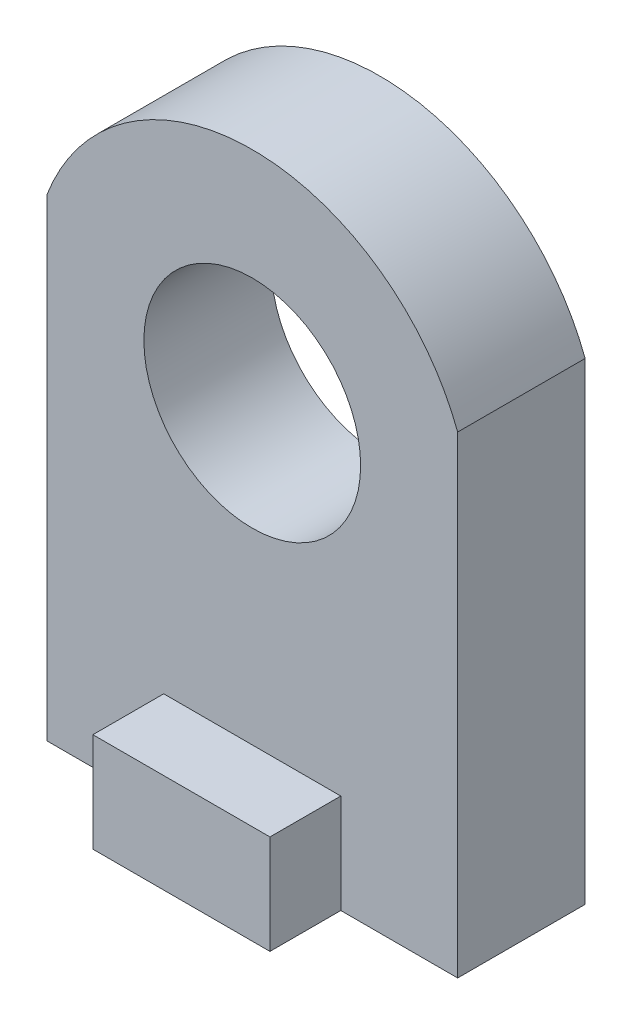
ISO-10303-21;
HEADER;
FILE_DESCRIPTION(('STEP AP214'),'2;1');
FILE_NAME('part.step','',(''),(''),'','','');
FILE_SCHEMA(('AUTOMOTIVE_DESIGN { 1 0 10303 214 1 1 1 1 }'));
ENDSEC;
DATA;
#1=APPLICATION_CONTEXT('core data for automotive mechanical design processes');
#2=APPLICATION_PROTOCOL_DEFINITION('international standard','automotive_design',2000,#1);
#3=PRODUCT_CONTEXT('',#1,'mechanical');
#4=PRODUCT('Part','Part','',(#3));
#5=PRODUCT_RELATED_PRODUCT_CATEGORY('part','',(#4));
#6=PRODUCT_DEFINITION_FORMATION('','',#4);
#7=PRODUCT_DEFINITION_CONTEXT('part definition',#1,'design');
#8=PRODUCT_DEFINITION('design','',#6,#7);
#9=PRODUCT_DEFINITION_SHAPE('','',#8);
#10=(LENGTH_UNIT() NAMED_UNIT(*) SI_UNIT(.MILLI.,.METRE.));
#11=(NAMED_UNIT(*) PLANE_ANGLE_UNIT() SI_UNIT($,.RADIAN.));
#12=(NAMED_UNIT(*) SI_UNIT($,.STERADIAN.) SOLID_ANGLE_UNIT());
#13=UNCERTAINTY_MEASURE_WITH_UNIT(LENGTH_MEASURE(1.E-05),#10,'distance_accuracy_value','');
#14=(GEOMETRIC_REPRESENTATION_CONTEXT(3) GLOBAL_UNCERTAINTY_ASSIGNED_CONTEXT((#13)) GLOBAL_UNIT_ASSIGNED_CONTEXT((#10,
#11,#12)) REPRESENTATION_CONTEXT('',''));
#15=CARTESIAN_POINT('',(0.,0.,0.));
#16=DIRECTION('',(0.,0.,1.));
#17=DIRECTION('',(1.,0.,0.));
#18=AXIS2_PLACEMENT_3D('',#15,#16,#17);
#19=CARTESIAN_POINT('',(0.,11.2113872124742,9.));
#20=DIRECTION('',(0.,0.,-1.));
#21=DIRECTION('',(-1.,0.,0.));
#22=AXIS2_PLACEMENT_3D('',#19,#20,#21);
#23=PLANE('',#22);
#24=CARTESIAN_POINT('',(0.,11.2113872124742,9.));
#25=DIRECTION('',(0.,0.,1.));
#26=DIRECTION('',(1.,0.,0.));
#27=AXIS2_PLACEMENT_3D('',#24,#25,#26);
#28=CIRCLE('',#27,7.65);
#29=CARTESIAN_POINT('',(7.65,11.2113872124742,9.));
#30=VERTEX_POINT('',#29);
#31=EDGE_CURVE('E126',#30,#30,#28,.T.);
#32=ORIENTED_EDGE('',*,*,#31,.F.);
#33=EDGE_LOOP('',(#32));
#34=FACE_BOUND('',#33,.T.);
#35=DIRECTION('',(0.,-1.,0.));
#36=VECTOR('',#35,1.);
#37=CARTESIAN_POINT('',(-6.25,-16.6886127875258,9.));
#38=LINE('',#37,#36);
#39=CARTESIAN_POINT('',(-6.25,-9.68861278752581,9.));
#40=VERTEX_POINT('',#39);
#41=CARTESIAN_POINT('',(-6.25,-16.6886127875258,9.));
#42=VERTEX_POINT('',#41);
#43=EDGE_CURVE('E51',#40,#42,#38,.T.);
#44=ORIENTED_EDGE('',*,*,#43,.F.);
#45=DIRECTION('',(-1.,0.,0.));
#46=VECTOR('',#45,1.);
#47=CARTESIAN_POINT('',(-6.25,-9.68861278752581,9.));
#48=LINE('',#47,#46);
#49=CARTESIAN_POINT('',(6.25,-9.68861278752581,9.));
#50=VERTEX_POINT('',#49);
#51=EDGE_CURVE('E120',#50,#40,#48,.T.);
#52=ORIENTED_EDGE('',*,*,#51,.F.);
#53=DIRECTION('',(0.,1.,0.));
#54=VECTOR('',#53,1.);
#55=CARTESIAN_POINT('',(6.25,-16.6886127875258,9.));
#56=LINE('',#55,#54);
#57=CARTESIAN_POINT('',(6.25,-16.6886127875258,9.));
#58=VERTEX_POINT('',#57);
#59=EDGE_CURVE('E57',#58,#50,#56,.T.);
#60=ORIENTED_EDGE('',*,*,#59,.F.);
#61=DIRECTION('',(1.,0.,0.));
#62=VECTOR('',#61,1.);
#63=CARTESIAN_POINT('',(-14.5,-16.6886127875258,9.));
#64=LINE('',#63,#62);
#65=CARTESIAN_POINT('',(14.5,-16.6886127875258,9.));
#66=VERTEX_POINT('',#65);
#67=EDGE_CURVE('E141',#58,#66,#64,.T.);
#68=ORIENTED_EDGE('',*,*,#67,.T.);
#69=DIRECTION('',(0.,1.,0.));
#70=VECTOR('',#69,1.);
#71=CARTESIAN_POINT('',(14.5,-16.6886127875258,9.));
#72=LINE('',#71,#70);
#73=CARTESIAN_POINT('',(14.5,16.6886127875258,9.));
#74=VERTEX_POINT('',#73);
#75=EDGE_CURVE('E144',#66,#74,#72,.T.);
#76=ORIENTED_EDGE('',*,*,#75,.T.);
#77=CARTESIAN_POINT('',(0.,11.2113872124742,9.));
#78=DIRECTION('',(0.,0.,1.));
#79=DIRECTION('',(-1.,0.,0.));
#80=AXIS2_PLACEMENT_3D('',#77,#78,#79);
#81=CIRCLE('',#80,15.5);
#82=CARTESIAN_POINT('',(-14.5,16.6886127875258,9.));
#83=VERTEX_POINT('',#82);
#84=EDGE_CURVE('E135',#74,#83,#81,.T.);
#85=ORIENTED_EDGE('',*,*,#84,.T.);
#86=DIRECTION('',(0.,-1.,0.));
#87=VECTOR('',#86,1.);
#88=CARTESIAN_POINT('',(-14.5,-16.6886127875258,9.));
#89=LINE('',#88,#87);
#90=CARTESIAN_POINT('',(-14.5,-16.6886127875258,9.));
#91=VERTEX_POINT('',#90);
#92=EDGE_CURVE('E138',#83,#91,#89,.T.);
#93=ORIENTED_EDGE('',*,*,#92,.T.);
#94=EDGE_CURVE('E142',#91,#42,#64,.T.);
#95=ORIENTED_EDGE('',*,*,#94,.T.);
#96=EDGE_LOOP('',(#44,#52,#60,#68,#76,#85,#93,#95));
#97=FACE_BOUND('',#96,.T.);
#98=ADVANCED_FACE('F36',(#34,#97),#23,.F.);
#99=CARTESIAN_POINT('',(0.,11.2113872124742,0.));
#100=DIRECTION('',(0.,0.,-1.));
#101=DIRECTION('',(-1.,0.,0.));
#102=AXIS2_PLACEMENT_3D('',#99,#100,#101);
#103=PLANE('',#102);
#104=CARTESIAN_POINT('',(0.,11.2113872124742,0.));
#105=DIRECTION('',(0.,0.,1.));
#106=DIRECTION('',(-1.,0.,0.));
#107=AXIS2_PLACEMENT_3D('',#104,#105,#106);
#108=CIRCLE('',#107,15.5);
#109=CARTESIAN_POINT('',(14.5,16.6886127875258,0.));
#110=VERTEX_POINT('',#109);
#111=CARTESIAN_POINT('',(-14.5,16.6886127875258,0.));
#112=VERTEX_POINT('',#111);
#113=EDGE_CURVE('E133',#110,#112,#108,.T.);
#114=ORIENTED_EDGE('',*,*,#113,.F.);
#115=DIRECTION('',(0.,1.,0.));
#116=VECTOR('',#115,1.);
#117=CARTESIAN_POINT('',(14.5,-16.6886127875258,0.));
#118=LINE('',#117,#116);
#119=CARTESIAN_POINT('',(14.5,-16.6886127875258,0.));
#120=VERTEX_POINT('',#119);
#121=EDGE_CURVE('E139',#120,#110,#118,.T.);
#122=ORIENTED_EDGE('',*,*,#121,.F.);
#123=DIRECTION('',(1.,0.,0.));
#124=VECTOR('',#123,1.);
#125=CARTESIAN_POINT('',(-14.5,-16.6886127875258,0.));
#126=LINE('',#125,#124);
#127=CARTESIAN_POINT('',(-14.5,-16.6886127875258,0.));
#128=VERTEX_POINT('',#127);
#129=EDGE_CURVE('E151',#128,#120,#126,.T.);
#130=ORIENTED_EDGE('',*,*,#129,.F.);
#131=DIRECTION('',(0.,-1.,0.));
#132=VECTOR('',#131,1.);
#133=CARTESIAN_POINT('',(-14.5,-16.6886127875258,0.));
#134=LINE('',#133,#132);
#135=EDGE_CURVE('E149',#112,#128,#134,.T.);
#136=ORIENTED_EDGE('',*,*,#135,.F.);
#137=EDGE_LOOP('',(#114,#122,#130,#136));
#138=FACE_BOUND('',#137,.T.);
#139=CARTESIAN_POINT('',(0.,11.2113872124742,0.));
#140=DIRECTION('',(0.,0.,1.));
#141=DIRECTION('',(1.,0.,0.));
#142=AXIS2_PLACEMENT_3D('',#139,#140,#141);
#143=CIRCLE('',#142,7.65);
#144=CARTESIAN_POINT('',(7.65,11.2113872124742,0.));
#145=VERTEX_POINT('',#144);
#146=EDGE_CURVE('E123',#145,#145,#143,.T.);
#147=ORIENTED_EDGE('',*,*,#146,.T.);
#148=EDGE_LOOP('',(#147));
#149=FACE_BOUND('',#148,.T.);
#150=ADVANCED_FACE('F166',(#138,#149),#103,.T.);
#151=CARTESIAN_POINT('',(0.,11.2113872124742,9.));
#152=DIRECTION('',(0.,0.,-1.));
#153=DIRECTION('',(-1.,0.,0.));
#154=AXIS2_PLACEMENT_3D('',#151,#152,#153);
#155=CYLINDRICAL_SURFACE('',#154,15.5);
#156=ORIENTED_EDGE('',*,*,#113,.T.);
#157=DIRECTION('',(0.,0.,-1.));
#158=VECTOR('',#157,1.);
#159=CARTESIAN_POINT('',(-14.5,16.6886127875258,9.));
#160=LINE('',#159,#158);
#161=EDGE_CURVE('E11',#83,#112,#160,.T.);
#162=ORIENTED_EDGE('',*,*,#161,.F.);
#163=ORIENTED_EDGE('',*,*,#84,.F.);
#164=DIRECTION('',(0.,0.,-1.));
#165=VECTOR('',#164,1.);
#166=CARTESIAN_POINT('',(14.5,16.6886127875258,9.));
#167=LINE('',#166,#165);
#168=EDGE_CURVE('E146',#74,#110,#167,.T.);
#169=ORIENTED_EDGE('',*,*,#168,.T.);
#170=EDGE_LOOP('',(#156,#162,#163,#169));
#171=FACE_BOUND('',#170,.T.);
#172=ADVANCED_FACE('F38',(#171),#155,.T.);
#173=CARTESIAN_POINT('',(-14.5,-16.6886127875258,9.));
#174=DIRECTION('',(1.,0.,0.));
#175=DIRECTION('',(0.,1.,0.));
#176=AXIS2_PLACEMENT_3D('',#173,#174,#175);
#177=PLANE('',#176);
#178=ORIENTED_EDGE('',*,*,#135,.T.);
#179=DIRECTION('',(0.,0.,-1.));
#180=VECTOR('',#179,1.);
#181=CARTESIAN_POINT('',(-14.5,-16.6886127875258,9.));
#182=LINE('',#181,#180);
#183=EDGE_CURVE('E44',#91,#128,#182,.T.);
#184=ORIENTED_EDGE('',*,*,#183,.F.);
#185=ORIENTED_EDGE('',*,*,#92,.F.);
#186=ORIENTED_EDGE('',*,*,#161,.T.);
#187=EDGE_LOOP('',(#178,#184,#185,#186));
#188=FACE_BOUND('',#187,.T.);
#189=ADVANCED_FACE('F211',(#188),#177,.F.);
#190=CARTESIAN_POINT('',(-14.5,-16.6886127875258,9.));
#191=DIRECTION('',(0.,1.,0.));
#192=DIRECTION('',(0.,0.,1.));
#193=AXIS2_PLACEMENT_3D('',#190,#191,#192);
#194=PLANE('',#193);
#195=ORIENTED_EDGE('',*,*,#129,.T.);
#196=DIRECTION('',(0.,0.,-1.));
#197=VECTOR('',#196,1.);
#198=CARTESIAN_POINT('',(14.5,-16.6886127875258,9.));
#199=LINE('',#198,#197);
#200=EDGE_CURVE('E156',#66,#120,#199,.T.);
#201=ORIENTED_EDGE('',*,*,#200,.F.);
#202=ORIENTED_EDGE('',*,*,#67,.F.);
#203=DIRECTION('',(0.,0.,-1.));
#204=VECTOR('',#203,1.);
#205=CARTESIAN_POINT('',(6.25,-16.6886127875258,14.));
#206=LINE('',#205,#204);
#207=CARTESIAN_POINT('',(6.25,-16.6886127875258,14.));
#208=VERTEX_POINT('',#207);
#209=EDGE_CURVE('E107',#208,#58,#206,.T.);
#210=ORIENTED_EDGE('',*,*,#209,.F.);
#211=DIRECTION('',(1.,0.,0.));
#212=VECTOR('',#211,1.);
#213=CARTESIAN_POINT('',(-6.25,-16.6886127875258,14.));
#214=LINE('',#213,#212);
#215=CARTESIAN_POINT('',(-6.25,-16.6886127875258,14.));
#216=VERTEX_POINT('',#215);
#217=EDGE_CURVE('E100',#216,#208,#214,.T.);
#218=ORIENTED_EDGE('',*,*,#217,.F.);
#219=DIRECTION('',(0.,0.,-1.));
#220=VECTOR('',#219,1.);
#221=CARTESIAN_POINT('',(-6.25,-16.6886127875258,14.));
#222=LINE('',#221,#220);
#223=EDGE_CURVE('E105',#216,#42,#222,.T.);
#224=ORIENTED_EDGE('',*,*,#223,.T.);
#225=ORIENTED_EDGE('',*,*,#94,.F.);
#226=ORIENTED_EDGE('',*,*,#183,.T.);
#227=EDGE_LOOP('',(#195,#201,#202,#210,#218,#224,#225,#226));
#228=FACE_BOUND('',#227,.T.);
#229=ADVANCED_FACE('F102',(#228),#194,.F.);
#230=CARTESIAN_POINT('',(14.5,-16.6886127875258,9.));
#231=DIRECTION('',(-1.,0.,0.));
#232=DIRECTION('',(0.,-1.,0.));
#233=AXIS2_PLACEMENT_3D('',#230,#231,#232);
#234=PLANE('',#233);
#235=ORIENTED_EDGE('',*,*,#121,.T.);
#236=ORIENTED_EDGE('',*,*,#168,.F.);
#237=ORIENTED_EDGE('',*,*,#75,.F.);
#238=ORIENTED_EDGE('',*,*,#200,.T.);
#239=EDGE_LOOP('',(#235,#236,#237,#238));
#240=FACE_BOUND('',#239,.T.);
#241=ADVANCED_FACE('F170',(#240),#234,.F.);
#242=CARTESIAN_POINT('',(0.,11.2113872124742,9.));
#243=DIRECTION('',(0.,0.,-1.));
#244=DIRECTION('',(-1.,0.,0.));
#245=AXIS2_PLACEMENT_3D('',#242,#243,#244);
#246=CYLINDRICAL_SURFACE('',#245,7.65);
#247=ORIENTED_EDGE('',*,*,#31,.T.);
#248=EDGE_LOOP('',(#247));
#249=FACE_BOUND('',#248,.T.);
#250=ORIENTED_EDGE('',*,*,#146,.F.);
#251=EDGE_LOOP('',(#250));
#252=FACE_BOUND('',#251,.T.);
#253=ADVANCED_FACE('F205',(#249,#252),#246,.F.);
#254=CARTESIAN_POINT('',(-6.25,-16.6886127875258,14.));
#255=DIRECTION('',(1.,0.,0.));
#256=DIRECTION('',(0.,0.,-1.));
#257=AXIS2_PLACEMENT_3D('',#254,#255,#256);
#258=PLANE('',#257);
#259=ORIENTED_EDGE('',*,*,#43,.T.);
#260=ORIENTED_EDGE('',*,*,#223,.F.);
#261=DIRECTION('',(0.,-1.,0.));
#262=VECTOR('',#261,1.);
#263=CARTESIAN_POINT('',(-6.25,-16.6886127875258,14.));
#264=LINE('',#263,#262);
#265=CARTESIAN_POINT('',(-6.25,-9.68861278752581,14.));
#266=VERTEX_POINT('',#265);
#267=EDGE_CURVE('E111',#266,#216,#264,.T.);
#268=ORIENTED_EDGE('',*,*,#267,.F.);
#269=DIRECTION('',(0.,0.,-1.));
#270=VECTOR('',#269,1.);
#271=CARTESIAN_POINT('',(-6.25,-9.68861278752581,14.));
#272=LINE('',#271,#270);
#273=EDGE_CURVE('E180',#266,#40,#272,.T.);
#274=ORIENTED_EDGE('',*,*,#273,.T.);
#275=EDGE_LOOP('',(#259,#260,#268,#274));
#276=FACE_BOUND('',#275,.T.);
#277=ADVANCED_FACE('F122',(#276),#258,.F.);
#278=CARTESIAN_POINT('',(6.25,-16.6886127875258,14.));
#279=DIRECTION('',(-1.,0.,0.));
#280=DIRECTION('',(0.,-1.,0.));
#281=AXIS2_PLACEMENT_3D('',#278,#279,#280);
#282=PLANE('',#281);
#283=ORIENTED_EDGE('',*,*,#59,.T.);
#284=DIRECTION('',(0.,0.,-1.));
#285=VECTOR('',#284,1.);
#286=CARTESIAN_POINT('',(6.25,-9.68861278752581,14.));
#287=LINE('',#286,#285);
#288=CARTESIAN_POINT('',(6.25,-9.68861278752581,14.));
#289=VERTEX_POINT('',#288);
#290=EDGE_CURVE('E128',#289,#50,#287,.T.);
#291=ORIENTED_EDGE('',*,*,#290,.F.);
#292=DIRECTION('',(0.,1.,0.));
#293=VECTOR('',#292,1.);
#294=CARTESIAN_POINT('',(6.25,-16.6886127875258,14.));
#295=LINE('',#294,#293);
#296=EDGE_CURVE('E110',#208,#289,#295,.T.);
#297=ORIENTED_EDGE('',*,*,#296,.F.);
#298=ORIENTED_EDGE('',*,*,#209,.T.);
#299=EDGE_LOOP('',(#283,#291,#297,#298));
#300=FACE_BOUND('',#299,.T.);
#301=ADVANCED_FACE('F176',(#300),#282,.F.);
#302=CARTESIAN_POINT('',(-6.25,-9.68861278752581,14.));
#303=DIRECTION('',(0.,-1.,0.));
#304=DIRECTION('',(1.,0.,0.));
#305=AXIS2_PLACEMENT_3D('',#302,#303,#304);
#306=PLANE('',#305);
#307=ORIENTED_EDGE('',*,*,#51,.T.);
#308=ORIENTED_EDGE('',*,*,#273,.F.);
#309=DIRECTION('',(-1.,0.,0.));
#310=VECTOR('',#309,1.);
#311=CARTESIAN_POINT('',(-6.25,-9.68861278752581,14.));
#312=LINE('',#311,#310);
#313=EDGE_CURVE('E116',#289,#266,#312,.T.);
#314=ORIENTED_EDGE('',*,*,#313,.F.);
#315=ORIENTED_EDGE('',*,*,#290,.T.);
#316=EDGE_LOOP('',(#307,#308,#314,#315));
#317=FACE_BOUND('',#316,.T.);
#318=ADVANCED_FACE('F187',(#317),#306,.F.);
#319=CARTESIAN_POINT('',(0.,0.,14.));
#320=DIRECTION('',(0.,0.,-1.));
#321=DIRECTION('',(-1.,0.,0.));
#322=AXIS2_PLACEMENT_3D('',#319,#320,#321);
#323=PLANE('',#322);
#324=ORIENTED_EDGE('',*,*,#267,.T.);
#325=ORIENTED_EDGE('',*,*,#217,.T.);
#326=ORIENTED_EDGE('',*,*,#296,.T.);
#327=ORIENTED_EDGE('',*,*,#313,.T.);
#328=EDGE_LOOP('',(#324,#325,#326,#327));
#329=FACE_BOUND('',#328,.T.);
#330=ADVANCED_FACE('F114',(#329),#323,.F.);
#331=CLOSED_SHELL('',(#98,#150,#172,#189,#229,#241,#253,#277,#301,#318,#330));
#332=MANIFOLD_SOLID_BREP('B2',#331);
#333=ADVANCED_BREP_SHAPE_REPRESENTATION('',(#18,#332),#14);
#334=SHAPE_DEFINITION_REPRESENTATION(#9,#333);
ENDSEC;
END-ISO-10303-21;
